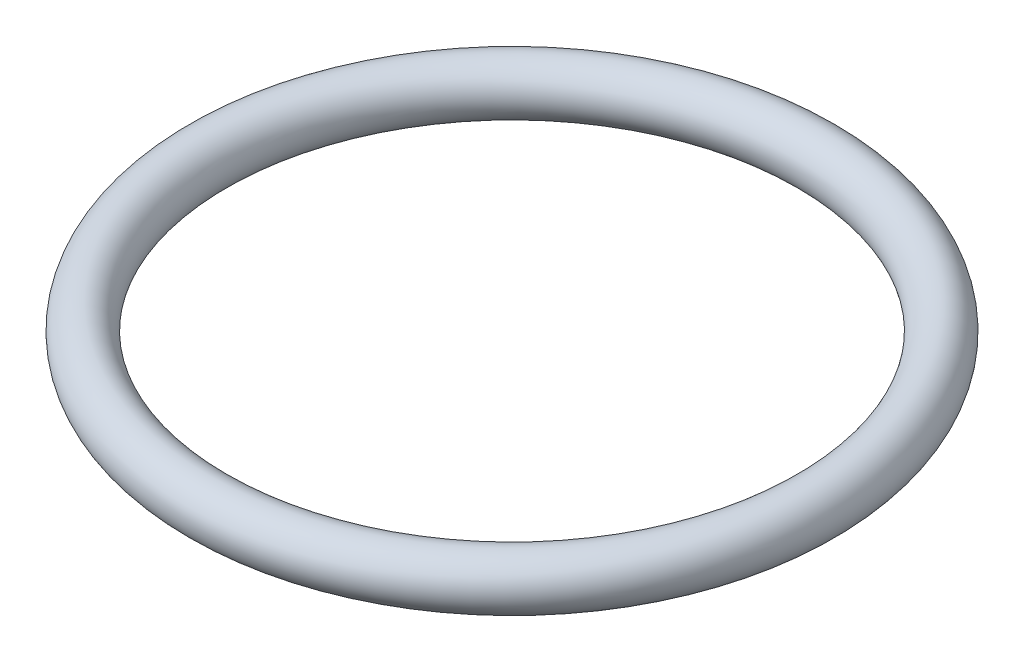
ISO-10303-21;
HEADER;
FILE_DESCRIPTION(('STEP AP214'),'2;1');
FILE_NAME('part.step','',(''),(''),'','','');
FILE_SCHEMA(('AUTOMOTIVE_DESIGN { 1 0 10303 214 1 1 1 1 }'));
ENDSEC;
DATA;
#1=APPLICATION_CONTEXT('core data for automotive mechanical design processes');
#2=APPLICATION_PROTOCOL_DEFINITION('international standard','automotive_design',2000,#1);
#3=PRODUCT_CONTEXT('',#1,'mechanical');
#4=PRODUCT('Part','Part','',(#3));
#5=PRODUCT_RELATED_PRODUCT_CATEGORY('part','',(#4));
#6=PRODUCT_DEFINITION_FORMATION('','',#4);
#7=PRODUCT_DEFINITION_CONTEXT('part definition',#1,'design');
#8=PRODUCT_DEFINITION('design','',#6,#7);
#9=PRODUCT_DEFINITION_SHAPE('','',#8);
#10=(LENGTH_UNIT() NAMED_UNIT(*) SI_UNIT(.MILLI.,.METRE.));
#11=(NAMED_UNIT(*) PLANE_ANGLE_UNIT() SI_UNIT($,.RADIAN.));
#12=(NAMED_UNIT(*) SI_UNIT($,.STERADIAN.) SOLID_ANGLE_UNIT());
#13=UNCERTAINTY_MEASURE_WITH_UNIT(LENGTH_MEASURE(1.E-05),#10,'distance_accuracy_value','');
#14=(GEOMETRIC_REPRESENTATION_CONTEXT(3) GLOBAL_UNCERTAINTY_ASSIGNED_CONTEXT((#13)) GLOBAL_UNIT_ASSIGNED_CONTEXT((#10,
#11,#12)) REPRESENTATION_CONTEXT('',''));
#15=CARTESIAN_POINT('',(0.,0.,0.));
#16=DIRECTION('',(0.,0.,1.));
#17=DIRECTION('',(1.,0.,0.));
#18=AXIS2_PLACEMENT_3D('',#15,#16,#17);
#19=CARTESIAN_POINT('',(0.,-1.38996771953505,0.));
#20=DIRECTION('',(0.,1.,0.));
#21=DIRECTION('',(0.,0.,1.));
#22=AXIS2_PLACEMENT_3D('',#19,#20,#21);
#23=TOROIDAL_SURFACE('',#22,17.5,1.5);
#24=CARTESIAN_POINT('',(0.,-1.38996771953505,19.));
#25=VERTEX_POINT('',#24);
#26=VERTEX_LOOP('',#25);
#27=FACE_BOUND('',#26,.T.);
#28=ADVANCED_FACE('F38',(#27),#23,.T.);
#29=CLOSED_SHELL('',(#28));
#30=MANIFOLD_SOLID_BREP('B2',#29);
#31=ADVANCED_BREP_SHAPE_REPRESENTATION('',(#18,#30),#14);
#32=SHAPE_DEFINITION_REPRESENTATION(#9,#31);
ENDSEC;
END-ISO-10303-21;
